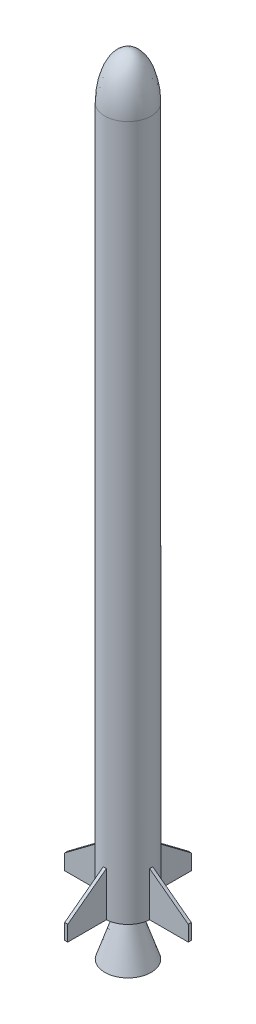
ISO-10303-21;
HEADER;
FILE_DESCRIPTION(('STEP AP214'),'2;1');
FILE_NAME('part.step','',(''),(''),'','','');
FILE_SCHEMA(('AUTOMOTIVE_DESIGN { 1 0 10303 214 1 1 1 1 }'));
ENDSEC;
DATA;
#1=APPLICATION_CONTEXT('core data for automotive mechanical design processes');
#2=APPLICATION_PROTOCOL_DEFINITION('international standard','automotive_design',2000,#1);
#3=PRODUCT_CONTEXT('',#1,'mechanical');
#4=PRODUCT('Part','Part','',(#3));
#5=PRODUCT_RELATED_PRODUCT_CATEGORY('part','',(#4));
#6=PRODUCT_DEFINITION_FORMATION('','',#4);
#7=PRODUCT_DEFINITION_CONTEXT('part definition',#1,'design');
#8=PRODUCT_DEFINITION('design','',#6,#7);
#9=PRODUCT_DEFINITION_SHAPE('','',#8);
#10=(LENGTH_UNIT() NAMED_UNIT(*) SI_UNIT(.MILLI.,.METRE.));
#11=(NAMED_UNIT(*) PLANE_ANGLE_UNIT() SI_UNIT($,.RADIAN.));
#12=(NAMED_UNIT(*) SI_UNIT($,.STERADIAN.) SOLID_ANGLE_UNIT());
#13=UNCERTAINTY_MEASURE_WITH_UNIT(LENGTH_MEASURE(1.E-05),#10,'distance_accuracy_value','');
#14=(GEOMETRIC_REPRESENTATION_CONTEXT(3) GLOBAL_UNCERTAINTY_ASSIGNED_CONTEXT((#13)) GLOBAL_UNIT_ASSIGNED_CONTEXT((#10,
#11,#12)) REPRESENTATION_CONTEXT('',''));
#15=CARTESIAN_POINT('',(0.,0.,0.));
#16=DIRECTION('',(0.,0.,1.));
#17=DIRECTION('',(1.,0.,0.));
#18=AXIS2_PLACEMENT_3D('',#15,#16,#17);
#19=CARTESIAN_POINT('',(0.,0.,0.));
#20=DIRECTION('',(0.,-1.,0.));
#21=DIRECTION('',(0.,0.,-1.));
#22=AXIS2_PLACEMENT_3D('',#19,#20,#21);
#23=CYLINDRICAL_SURFACE('',#22,38.1);
#24=CARTESIAN_POINT('',(0.,1143.,0.));
#25=DIRECTION('',(0.,-1.,0.));
#26=DIRECTION('',(0.,0.,-1.));
#27=AXIS2_PLACEMENT_3D('',#24,#25,#26);
#28=CIRCLE('',#27,38.1);
#29=CARTESIAN_POINT('',(0.,1143.,-38.1));
#30=VERTEX_POINT('',#29);
#31=EDGE_CURVE('E449',#30,#30,#28,.T.);
#32=ORIENTED_EDGE('',*,*,#31,.T.);
#33=EDGE_LOOP('',(#32));
#34=FACE_BOUND('',#33,.T.);
#35=CARTESIAN_POINT('',(0.,101.6,0.));
#36=DIRECTION('',(0.,0.8,-0.6));
#37=DIRECTION('',(0.,-0.6,-0.8));
#38=AXIS2_PLACEMENT_3D('',#35,#36,#37);
#39=ELLIPSE('',#38,47.625,38.1);
#40=CARTESIAN_POINT('',(-2.54000000000013,73.0885707127825,-38.0152390496233));
#41=VERTEX_POINT('',#40);
#42=CARTESIAN_POINT('',(2.53999999999987,73.0885707127826,-38.0152390496232));
#43=VERTEX_POINT('',#42);
#44=EDGE_CURVE('E81',#41,#43,#39,.F.);
#45=ORIENTED_EDGE('',*,*,#44,.F.);
#46=DIRECTION('',(0.,-1.,0.));
#47=VECTOR('',#46,1.);
#48=CARTESIAN_POINT('',(-2.54000000000013,0.,-38.0152390496232));
#49=LINE('',#48,#47);
#50=CARTESIAN_POINT('',(-2.54000000000013,0.,-38.0152390496232));
#51=VERTEX_POINT('',#50);
#52=EDGE_CURVE('E394',#41,#51,#49,.T.);
#53=ORIENTED_EDGE('',*,*,#52,.T.);
#54=CARTESIAN_POINT('',(0.,0.,0.));
#55=DIRECTION('',(0.,-1.,0.));
#56=DIRECTION('',(0.,0.,-1.));
#57=AXIS2_PLACEMENT_3D('',#54,#55,#56);
#58=CIRCLE('',#57,38.1);
#59=CARTESIAN_POINT('',(-38.0152390496232,0.,-2.54));
#60=VERTEX_POINT('',#59);
#61=EDGE_CURVE('E608',#60,#51,#58,.T.);
#62=ORIENTED_EDGE('',*,*,#61,.F.);
#63=DIRECTION('',(0.,-1.,0.));
#64=VECTOR('',#63,1.);
#65=CARTESIAN_POINT('',(-38.0152390496232,0.,-2.54));
#66=LINE('',#65,#64);
#67=CARTESIAN_POINT('',(-38.0152390496233,73.0885707127825,-2.54));
#68=VERTEX_POINT('',#67);
#69=EDGE_CURVE('E363',#68,#60,#66,.T.);
#70=ORIENTED_EDGE('',*,*,#69,.F.);
#71=CARTESIAN_POINT('',(0.,101.6,0.));
#72=DIRECTION('',(-0.6,0.8,0.));
#73=DIRECTION('',(-0.8,-0.6,0.));
#74=AXIS2_PLACEMENT_3D('',#71,#72,#73);
#75=ELLIPSE('',#74,47.625,38.1);
#76=CARTESIAN_POINT('',(-38.0152390496233,73.0885707127825,2.54));
#77=VERTEX_POINT('',#76);
#78=EDGE_CURVE('E505',#77,#68,#75,.F.);
#79=ORIENTED_EDGE('',*,*,#78,.F.);
#80=DIRECTION('',(0.,-1.,0.));
#81=VECTOR('',#80,1.);
#82=CARTESIAN_POINT('',(-38.0152390496232,0.,2.54));
#83=LINE('',#82,#81);
#84=CARTESIAN_POINT('',(-38.0152390496232,0.,2.54));
#85=VERTEX_POINT('',#84);
#86=EDGE_CURVE('E359',#77,#85,#83,.T.);
#87=ORIENTED_EDGE('',*,*,#86,.T.);
#88=CARTESIAN_POINT('',(-2.5399999999996,0.,38.0152390496233));
#89=VERTEX_POINT('',#88);
#90=EDGE_CURVE('E614',#89,#85,#58,.T.);
#91=ORIENTED_EDGE('',*,*,#90,.F.);
#92=DIRECTION('',(0.,-1.,0.));
#93=VECTOR('',#92,1.);
#94=CARTESIAN_POINT('',(-2.5399999999996,0.,38.0152390496233));
#95=LINE('',#94,#93);
#96=CARTESIAN_POINT('',(-2.5399999999996,73.0885707127825,38.0152390496233));
#97=VERTEX_POINT('',#96);
#98=EDGE_CURVE('E187',#97,#89,#95,.T.);
#99=ORIENTED_EDGE('',*,*,#98,.F.);
#100=CARTESIAN_POINT('',(0.,101.6,0.));
#101=DIRECTION('',(0.,0.8,0.6));
#102=DIRECTION('',(0.,-0.6,0.8));
#103=AXIS2_PLACEMENT_3D('',#100,#101,#102);
#104=ELLIPSE('',#103,47.625,38.1);
#105=CARTESIAN_POINT('',(2.5400000000004,73.0885707127825,38.0152390496232));
#106=VERTEX_POINT('',#105);
#107=EDGE_CURVE('E592',#106,#97,#104,.F.);
#108=ORIENTED_EDGE('',*,*,#107,.F.);
#109=DIRECTION('',(0.,-1.,0.));
#110=VECTOR('',#109,1.);
#111=CARTESIAN_POINT('',(2.54000000000013,0.,38.0152390496232));
#112=LINE('',#111,#110);
#113=CARTESIAN_POINT('',(2.54000000000013,0.,38.0152390496232));
#114=VERTEX_POINT('',#113);
#115=EDGE_CURVE('E379',#114,#106,#112,.F.);
#116=ORIENTED_EDGE('',*,*,#115,.F.);
#117=CARTESIAN_POINT('',(38.0152390496232,0.,2.54));
#118=VERTEX_POINT('',#117);
#119=EDGE_CURVE('E454',#118,#114,#58,.T.);
#120=ORIENTED_EDGE('',*,*,#119,.F.);
#121=DIRECTION('',(0.,-1.,0.));
#122=VECTOR('',#121,1.);
#123=CARTESIAN_POINT('',(38.0152390496232,0.,2.54));
#124=LINE('',#123,#122);
#125=CARTESIAN_POINT('',(38.0152390496232,73.0885707127825,2.54));
#126=VERTEX_POINT('',#125);
#127=EDGE_CURVE('E486',#126,#118,#124,.T.);
#128=ORIENTED_EDGE('',*,*,#127,.F.);
#129=CARTESIAN_POINT('',(0.,101.6,0.));
#130=DIRECTION('',(0.6,0.8,0.));
#131=DIRECTION('',(0.8,-0.6,0.));
#132=AXIS2_PLACEMENT_3D('',#129,#130,#131);
#133=ELLIPSE('',#132,47.625,38.1);
#134=CARTESIAN_POINT('',(38.0152390496233,73.0885707127825,-2.54));
#135=VERTEX_POINT('',#134);
#136=EDGE_CURVE('E491',#135,#126,#133,.F.);
#137=ORIENTED_EDGE('',*,*,#136,.F.);
#138=DIRECTION('',(0.,-1.,0.));
#139=VECTOR('',#138,1.);
#140=CARTESIAN_POINT('',(38.0152390496232,0.,-2.54));
#141=LINE('',#140,#139);
#142=CARTESIAN_POINT('',(38.0152390496232,0.,-2.54));
#143=VERTEX_POINT('',#142);
#144=EDGE_CURVE('E500',#135,#143,#141,.T.);
#145=ORIENTED_EDGE('',*,*,#144,.T.);
#146=CARTESIAN_POINT('',(2.53999999999987,0.,-38.0152390496232));
#147=VERTEX_POINT('',#146);
#148=EDGE_CURVE('E453',#147,#143,#58,.T.);
#149=ORIENTED_EDGE('',*,*,#148,.F.);
#150=DIRECTION('',(0.,-1.,0.));
#151=VECTOR('',#150,1.);
#152=CARTESIAN_POINT('',(2.53999999999987,0.,-38.0152390496232));
#153=LINE('',#152,#151);
#154=EDGE_CURVE('E374',#43,#147,#153,.T.);
#155=ORIENTED_EDGE('',*,*,#154,.F.);
#156=EDGE_LOOP('',(#45,#53,#62,#70,#79,#87,#91,#99,#108,#116,#120,#128,#137,#145,#149,#155));
#157=FACE_BOUND('',#156,.T.);
#158=ADVANCED_FACE('F57',(#34,#157),#23,.T.);
#159=CARTESIAN_POINT('',(0.,-76.2,0.));
#160=DIRECTION('',(0.,-1.,0.));
#161=DIRECTION('',(0.,0.,-1.));
#162=AXIS2_PLACEMENT_3D('',#159,#160,#161);
#163=PLANE('',#162);
#164=CARTESIAN_POINT('',(0.,-76.2,0.));
#165=DIRECTION('',(0.,-1.,0.));
#166=DIRECTION('',(0.,0.,-1.));
#167=AXIS2_PLACEMENT_3D('',#164,#165,#166);
#168=CIRCLE('',#167,31.75);
#169=CARTESIAN_POINT('',(0.,-76.2,-31.75));
#170=VERTEX_POINT('',#169);
#171=EDGE_CURVE('E12',#170,#170,#168,.T.);
#172=ORIENTED_EDGE('',*,*,#171,.F.);
#173=EDGE_LOOP('',(#172));
#174=FACE_BOUND('',#173,.T.);
#175=CARTESIAN_POINT('',(0.,-76.2,0.));
#176=DIRECTION('',(0.,-1.,0.));
#177=DIRECTION('',(0.,0.,-1.));
#178=AXIS2_PLACEMENT_3D('',#175,#176,#177);
#179=CIRCLE('',#178,38.1);
#180=CARTESIAN_POINT('',(0.,-76.2,-38.1));
#181=VERTEX_POINT('',#180);
#182=EDGE_CURVE('E472',#181,#181,#179,.T.);
#183=ORIENTED_EDGE('',*,*,#182,.T.);
#184=EDGE_LOOP('',(#183));
#185=FACE_BOUND('',#184,.T.);
#186=ADVANCED_FACE('F562',(#174,#185),#163,.T.);
#187=CARTESIAN_POINT('',(0.,-76.2,0.));
#188=DIRECTION('',(0.,-1.,0.));
#189=DIRECTION('',(0.,0.,-1.));
#190=AXIS2_PLACEMENT_3D('',#187,#188,#189);
#191=CONICAL_SURFACE('',#190,38.1,0.321750554396642);
#192=CARTESIAN_POINT('',(0.,0.,0.));
#193=DIRECTION('',(0.,-1.,0.));
#194=DIRECTION('',(0.,0.,-1.));
#195=AXIS2_PLACEMENT_3D('',#192,#193,#194);
#196=CIRCLE('',#195,12.7);
#197=CARTESIAN_POINT('',(0.,0.,-12.7));
#198=VERTEX_POINT('',#197);
#199=EDGE_CURVE('E468',#198,#198,#196,.T.);
#200=CARTESIAN_POINT('',(0.,0.,-12.7));
#201=CARTESIAN_POINT('',(0.,-0.793749999999986,-12.9645833333333));
#202=CARTESIAN_POINT('',(0.,-1.58749999999999,-13.2291666666667));
#203=CARTESIAN_POINT('',(0.,-3.17499999999999,-13.7583333333333));
#204=CARTESIAN_POINT('',(0.,-3.96874999999999,-14.0229166666667));
#205=CARTESIAN_POINT('',(0.,-5.55624999999999,-14.5520833333333));
#206=CARTESIAN_POINT('',(0.,-6.34999999999999,-14.8166666666667));
#207=CARTESIAN_POINT('',(0.,-7.93749999999999,-15.3458333333333));
#208=CARTESIAN_POINT('',(0.,-8.73124999999999,-15.6104166666667));
#209=CARTESIAN_POINT('',(0.,-10.31875,-16.1395833333333));
#210=CARTESIAN_POINT('',(0.,-11.1125,-16.4041666666667));
#211=CARTESIAN_POINT('',(0.,-12.7,-16.9333333333333));
#212=CARTESIAN_POINT('',(0.,-13.49375,-17.1979166666667));
#213=CARTESIAN_POINT('',(0.,-15.08125,-17.7270833333333));
#214=CARTESIAN_POINT('',(0.,-15.875,-17.9916666666667));
#215=CARTESIAN_POINT('',(0.,-17.4625,-18.5208333333333));
#216=CARTESIAN_POINT('',(0.,-18.25625,-18.7854166666667));
#217=CARTESIAN_POINT('',(0.,-19.84375,-19.3145833333333));
#218=CARTESIAN_POINT('',(0.,-20.6375,-19.5791666666667));
#219=CARTESIAN_POINT('',(0.,-22.225,-20.1083333333333));
#220=CARTESIAN_POINT('',(0.,-23.01875,-20.3729166666667));
#221=CARTESIAN_POINT('',(0.,-24.60625,-20.9020833333333));
#222=CARTESIAN_POINT('',(0.,-25.4,-21.1666666666667));
#223=CARTESIAN_POINT('',(0.,-26.9875,-21.6958333333333));
#224=CARTESIAN_POINT('',(0.,-27.78125,-21.9604166666667));
#225=CARTESIAN_POINT('',(0.,-29.36875,-22.4895833333333));
#226=CARTESIAN_POINT('',(0.,-30.1625,-22.7541666666667));
#227=CARTESIAN_POINT('',(0.,-31.75,-23.2833333333333));
#228=CARTESIAN_POINT('',(0.,-32.54375,-23.5479166666667));
#229=CARTESIAN_POINT('',(0.,-34.13125,-24.0770833333333));
#230=CARTESIAN_POINT('',(0.,-34.925,-24.3416666666667));
#231=CARTESIAN_POINT('',(0.,-36.5125,-24.8708333333333));
#232=CARTESIAN_POINT('',(0.,-37.30625,-25.1354166666667));
#233=CARTESIAN_POINT('',(0.,-38.89375,-25.6645833333333));
#234=CARTESIAN_POINT('',(0.,-39.6875,-25.9291666666667));
#235=CARTESIAN_POINT('',(0.,-41.275,-26.4583333333333));
#236=CARTESIAN_POINT('',(0.,-42.06875,-26.7229166666667));
#237=CARTESIAN_POINT('',(0.,-43.65625,-27.2520833333333));
#238=CARTESIAN_POINT('',(0.,-44.45,-27.5166666666667));
#239=CARTESIAN_POINT('',(0.,-46.0375,-28.0458333333333));
#240=CARTESIAN_POINT('',(0.,-46.83125,-28.3104166666667));
#241=CARTESIAN_POINT('',(0.,-48.41875,-28.8395833333333));
#242=CARTESIAN_POINT('',(0.,-49.2125,-29.1041666666667));
#243=CARTESIAN_POINT('',(0.,-50.8,-29.6333333333333));
#244=CARTESIAN_POINT('',(0.,-51.59375,-29.8979166666667));
#245=CARTESIAN_POINT('',(0.,-53.18125,-30.4270833333333));
#246=CARTESIAN_POINT('',(0.,-53.975,-30.6916666666667));
#247=CARTESIAN_POINT('',(0.,-55.5625,-31.2208333333333));
#248=CARTESIAN_POINT('',(0.,-56.35625,-31.4854166666667));
#249=CARTESIAN_POINT('',(0.,-57.94375,-32.0145833333333));
#250=CARTESIAN_POINT('',(0.,-58.7375,-32.2791666666667));
#251=CARTESIAN_POINT('',(0.,-60.325,-32.8083333333333));
#252=CARTESIAN_POINT('',(0.,-61.11875,-33.0729166666667));
#253=CARTESIAN_POINT('',(0.,-62.70625,-33.6020833333333));
#254=CARTESIAN_POINT('',(0.,-63.5,-33.8666666666667));
#255=CARTESIAN_POINT('',(0.,-65.0875,-34.3958333333333));
#256=CARTESIAN_POINT('',(0.,-65.88125,-34.6604166666667));
#257=CARTESIAN_POINT('',(0.,-67.46875,-35.1895833333333));
#258=CARTESIAN_POINT('',(0.,-68.2625,-35.4541666666667));
#259=CARTESIAN_POINT('',(0.,-69.85,-35.9833333333333));
#260=CARTESIAN_POINT('',(0.,-70.64375,-36.2479166666667));
#261=CARTESIAN_POINT('',(0.,-72.23125,-36.7770833333333));
#262=CARTESIAN_POINT('',(0.,-73.025,-37.0416666666667));
#263=CARTESIAN_POINT('',(0.,-74.6125,-37.5708333333333));
#264=CARTESIAN_POINT('',(0.,-75.40625,-37.8354166666667));
#265=CARTESIAN_POINT('',(0.,-76.2,-38.1));
#266=B_SPLINE_CURVE_WITH_KNOTS('',3,(#200,#201,#202,#203,#204,#205,#206,#207,#208,#209,#210,
#211,#212,#213,#214,#215,#216,#217,#218,#219,#220,#221,#222,#223,#224,#225,#226,#227,#228,#229,
#230,#231,#232,#233,#234,#235,#236,#237,#238,#239,#240,#241,#242,#243,#244,#245,#246,#247,#248,
#249,#250,#251,#252,#253,#254,#255,#256,#257,#258,#259,#260,#261,#262,#263,#264,#265),
.UNSPECIFIED.,.F.,.F.,(4,2,2,2,2,2,2,2,2,2,2,2,2,2,2,2,2,2,2,2,2,2,2,2,2,2,2,2,2,2,2,2,4),(0.,
2.51005789275865,5.02011578551731,7.53017367827596,10.0402315710346,12.5502894637933,
15.0603473565519,17.5704052493106,20.0804631420692,22.5905210348279,25.1005789275865,
27.6106368203452,30.1206947131038,32.6307526058625,35.1408104986211,37.6508683913798,
40.1609262841384,42.6709841768971,45.1810420696557,47.6910999624144,50.2011578551731,
52.7112157479317,55.2212736406904,57.731331533449,60.2413894262077,62.7514473189663,
65.261505211725,67.7715631044836,70.2816209972423,72.7916788900009,75.3017367827596,
77.8117946755182,80.3218525682769),.UNSPECIFIED.);
#267=EDGE_CURVE('BSEAM565',#198,#181,#266,.T.);
#268=ORIENTED_EDGE('',*,*,#199,.T.);
#269=ORIENTED_EDGE('',*,*,#182,.F.);
#270=ORIENTED_EDGE('',*,*,#267,.T.);
#271=ORIENTED_EDGE('',*,*,#267,.F.);
#272=EDGE_LOOP('',(#268,#270,#269,#271));
#273=FACE_BOUND('',#272,.T.);
#274=ADVANCED_FACE('F565',(#273),#191,.T.);
#275=CARTESIAN_POINT('',(12.7,0.,0.));
#276=DIRECTION('',(0.,-1.,0.));
#277=DIRECTION('',(0.,0.,-1.));
#278=AXIS2_PLACEMENT_3D('',#275,#276,#277);
#279=PLANE('',#278);
#280=ORIENTED_EDGE('',*,*,#199,.F.);
#281=EDGE_LOOP('',(#280));
#282=FACE_BOUND('',#281,.T.);
#283=ORIENTED_EDGE('',*,*,#61,.T.);
#284=DIRECTION('',(0.,0.,-1.));
#285=VECTOR('',#284,1.);
#286=CARTESIAN_POINT('',(-2.54,0.,0.));
#287=LINE('',#286,#285);
#288=CARTESIAN_POINT('',(-2.54000000000035,0.,-101.6));
#289=VERTEX_POINT('',#288);
#290=EDGE_CURVE('E331',#51,#289,#287,.T.);
#291=ORIENTED_EDGE('',*,*,#290,.T.);
#292=DIRECTION('',(1.,0.,0.));
#293=VECTOR('',#292,1.);
#294=CARTESIAN_POINT('',(-2.54000000000035,0.,-101.6));
#295=LINE('',#294,#293);
#296=CARTESIAN_POINT('',(2.53999999999964,0.,-101.6));
#297=VERTEX_POINT('',#296);
#298=EDGE_CURVE('E346',#289,#297,#295,.T.);
#299=ORIENTED_EDGE('',*,*,#298,.T.);
#300=DIRECTION('',(0.,0.,-1.));
#301=VECTOR('',#300,1.);
#302=CARTESIAN_POINT('',(2.54,0.,0.));
#303=LINE('',#302,#301);
#304=EDGE_CURVE('E299',#147,#297,#303,.T.);
#305=ORIENTED_EDGE('',*,*,#304,.F.);
#306=ORIENTED_EDGE('',*,*,#148,.T.);
#307=DIRECTION('',(1.,0.,0.));
#308=VECTOR('',#307,1.);
#309=CARTESIAN_POINT('',(0.,0.,-2.54));
#310=LINE('',#309,#308);
#311=CARTESIAN_POINT('',(101.6,0.,-2.54));
#312=VERTEX_POINT('',#311);
#313=EDGE_CURVE('E409',#143,#312,#310,.T.);
#314=ORIENTED_EDGE('',*,*,#313,.T.);
#315=DIRECTION('',(0.,0.,1.));
#316=VECTOR('',#315,1.);
#317=CARTESIAN_POINT('',(101.6,0.,-2.54));
#318=LINE('',#317,#316);
#319=CARTESIAN_POINT('',(101.6,0.,2.54));
#320=VERTEX_POINT('',#319);
#321=EDGE_CURVE('E432',#312,#320,#318,.T.);
#322=ORIENTED_EDGE('',*,*,#321,.T.);
#323=DIRECTION('',(1.,0.,0.));
#324=VECTOR('',#323,1.);
#325=CARTESIAN_POINT('',(0.,0.,2.54));
#326=LINE('',#325,#324);
#327=EDGE_CURVE('E390',#118,#320,#326,.T.);
#328=ORIENTED_EDGE('',*,*,#327,.F.);
#329=ORIENTED_EDGE('',*,*,#119,.T.);
#330=CARTESIAN_POINT('',(2.54000000000106,0.,101.6));
#331=VERTEX_POINT('',#330);
#332=EDGE_CURVE('E199',#331,#114,#303,.T.);
#333=ORIENTED_EDGE('',*,*,#332,.F.);
#334=DIRECTION('',(-1.,0.,0.));
#335=VECTOR('',#334,1.);
#336=CARTESIAN_POINT('',(2.54000000000106,0.,101.6));
#337=LINE('',#336,#335);
#338=CARTESIAN_POINT('',(-2.53999999999894,0.,101.6));
#339=VERTEX_POINT('',#338);
#340=EDGE_CURVE('E194',#331,#339,#337,.T.);
#341=ORIENTED_EDGE('',*,*,#340,.T.);
#342=DIRECTION('',(0.,0.,1.));
#343=VECTOR('',#342,1.);
#344=CARTESIAN_POINT('',(-2.54,0.,0.));
#345=LINE('',#344,#343);
#346=EDGE_CURVE('E180',#89,#339,#345,.T.);
#347=ORIENTED_EDGE('',*,*,#346,.F.);
#348=ORIENTED_EDGE('',*,*,#90,.T.);
#349=DIRECTION('',(-1.,0.,0.));
#350=VECTOR('',#349,1.);
#351=CARTESIAN_POINT('',(0.,0.,2.54));
#352=LINE('',#351,#350);
#353=CARTESIAN_POINT('',(-101.6,0.,2.54));
#354=VERTEX_POINT('',#353);
#355=EDGE_CURVE('E266',#85,#354,#352,.T.);
#356=ORIENTED_EDGE('',*,*,#355,.T.);
#357=DIRECTION('',(0.,0.,-1.));
#358=VECTOR('',#357,1.);
#359=CARTESIAN_POINT('',(-101.6,0.,2.54));
#360=LINE('',#359,#358);
#361=CARTESIAN_POINT('',(-101.6,0.,-2.54));
#362=VERTEX_POINT('',#361);
#363=EDGE_CURVE('E300',#354,#362,#360,.T.);
#364=ORIENTED_EDGE('',*,*,#363,.T.);
#365=DIRECTION('',(-1.,0.,0.));
#366=VECTOR('',#365,1.);
#367=CARTESIAN_POINT('',(0.,0.,-2.54));
#368=LINE('',#367,#366);
#369=EDGE_CURVE('E250',#60,#362,#368,.T.);
#370=ORIENTED_EDGE('',*,*,#369,.F.);
#371=EDGE_LOOP('',(#283,#291,#299,#305,#306,#314,#322,#328,#329,#333,#341,#347,#348,#356,#364,#370));
#372=FACE_BOUND('',#371,.T.);
#373=ADVANCED_FACE('F196',(#282,#372),#279,.T.);
#374=CARTESIAN_POINT('',(0.,1143.,0.));
#375=DIRECTION('',(0.,0.,1.));
#376=DIRECTION('',(0.,1.,0.));
#377=AXIS2_PLACEMENT_3D('',#374,#375,#376);
#378=ELLIPSE('',#377,76.2000000000003,38.1);
#379=TRIMMED_CURVE('',#378,(PARAMETER_VALUE(3.14159265358978)),
(PARAMETER_VALUE(6.28318530717957)),.T.,.PARAMETER.);
#380=CARTESIAN_POINT('',(0.,0.,0.));
#381=DIRECTION('',(0.,-1.,0.));
#382=AXIS1_PLACEMENT('',#380,#381);
#383=SURFACE_OF_REVOLUTION('',#379,#382);
#384=CARTESIAN_POINT('',(0.,1219.2,0.));
#385=VERTEX_POINT('',#384);
#386=VERTEX_LOOP('',#385);
#387=FACE_BOUND('',#386,.T.);
#388=ORIENTED_EDGE('',*,*,#31,.F.);
#389=EDGE_LOOP('',(#388));
#390=FACE_BOUND('',#389,.T.);
#391=ADVANCED_FACE('F672',(#387,#390),#383,.F.);
#392=CARTESIAN_POINT('',(101.6,25.4,-2.54));
#393=DIRECTION('',(0.6,0.8,0.));
#394=DIRECTION('',(-0.8,0.6,0.));
#395=AXIS2_PLACEMENT_3D('',#392,#393,#394);
#396=PLANE('',#395);
#397=DIRECTION('',(-0.8,0.6,0.));
#398=VECTOR('',#397,1.);
#399=CARTESIAN_POINT('',(101.6,25.4,-2.54));
#400=LINE('',#399,#398);
#401=CARTESIAN_POINT('',(101.6,25.4,-2.54));
#402=VERTEX_POINT('',#401);
#403=EDGE_CURVE('E421',#402,#135,#400,.T.);
#404=ORIENTED_EDGE('',*,*,#403,.T.);
#405=ORIENTED_EDGE('',*,*,#136,.T.);
#406=DIRECTION('',(-0.8,0.6,0.));
#407=VECTOR('',#406,1.);
#408=CARTESIAN_POINT('',(101.6,25.4,2.54));
#409=LINE('',#408,#407);
#410=CARTESIAN_POINT('',(101.6,25.4,2.54));
#411=VERTEX_POINT('',#410);
#412=EDGE_CURVE('E404',#411,#126,#409,.T.);
#413=ORIENTED_EDGE('',*,*,#412,.F.);
#414=DIRECTION('',(0.,0.,1.));
#415=VECTOR('',#414,1.);
#416=CARTESIAN_POINT('',(101.6,25.4,-2.54));
#417=LINE('',#416,#415);
#418=EDGE_CURVE('E437',#402,#411,#417,.T.);
#419=ORIENTED_EDGE('',*,*,#418,.F.);
#420=EDGE_LOOP('',(#404,#405,#413,#419));
#421=FACE_BOUND('',#420,.T.);
#422=ADVANCED_FACE('F679',(#421),#396,.T.);
#423=CARTESIAN_POINT('',(101.6,0.,-2.54));
#424=DIRECTION('',(1.,0.,0.));
#425=DIRECTION('',(0.,0.,-1.));
#426=AXIS2_PLACEMENT_3D('',#423,#424,#425);
#427=PLANE('',#426);
#428=ORIENTED_EDGE('',*,*,#418,.T.);
#429=DIRECTION('',(0.,1.,0.));
#430=VECTOR('',#429,1.);
#431=CARTESIAN_POINT('',(101.6,0.,2.54));
#432=LINE('',#431,#430);
#433=EDGE_CURVE('E393',#320,#411,#432,.T.);
#434=ORIENTED_EDGE('',*,*,#433,.F.);
#435=ORIENTED_EDGE('',*,*,#321,.F.);
#436=DIRECTION('',(0.,1.,0.));
#437=VECTOR('',#436,1.);
#438=CARTESIAN_POINT('',(101.6,0.,-2.54));
#439=LINE('',#438,#437);
#440=EDGE_CURVE('E417',#312,#402,#439,.T.);
#441=ORIENTED_EDGE('',*,*,#440,.T.);
#442=EDGE_LOOP('',(#428,#434,#435,#441));
#443=FACE_BOUND('',#442,.T.);
#444=ADVANCED_FACE('F681',(#443),#427,.T.);
#445=CARTESIAN_POINT('',(0.,0.,-2.54));
#446=DIRECTION('',(0.,0.,1.));
#447=DIRECTION('',(1.,0.,0.));
#448=AXIS2_PLACEMENT_3D('',#445,#446,#447);
#449=PLANE('',#448);
#450=ORIENTED_EDGE('',*,*,#144,.F.);
#451=ORIENTED_EDGE('',*,*,#403,.F.);
#452=ORIENTED_EDGE('',*,*,#440,.F.);
#453=ORIENTED_EDGE('',*,*,#313,.F.);
#454=EDGE_LOOP('',(#450,#451,#452,#453));
#455=FACE_BOUND('',#454,.T.);
#456=ADVANCED_FACE('F684',(#455),#449,.F.);
#457=CARTESIAN_POINT('',(0.,0.,2.54));
#458=DIRECTION('',(0.,0.,1.));
#459=DIRECTION('',(1.,0.,0.));
#460=AXIS2_PLACEMENT_3D('',#457,#458,#459);
#461=PLANE('',#460);
#462=ORIENTED_EDGE('',*,*,#412,.T.);
#463=ORIENTED_EDGE('',*,*,#127,.T.);
#464=ORIENTED_EDGE('',*,*,#327,.T.);
#465=ORIENTED_EDGE('',*,*,#433,.T.);
#466=EDGE_LOOP('',(#462,#463,#464,#465));
#467=FACE_BOUND('',#466,.T.);
#468=ADVANCED_FACE('F691',(#467),#461,.T.);
#469=CARTESIAN_POINT('',(-101.6,0.,2.54));
#470=DIRECTION('',(-1.,0.,0.));
#471=DIRECTION('',(0.,0.,1.));
#472=AXIS2_PLACEMENT_3D('',#469,#470,#471);
#473=PLANE('',#472);
#474=DIRECTION('',(0.,0.,-1.));
#475=VECTOR('',#474,1.);
#476=CARTESIAN_POINT('',(-101.6,25.4,2.54));
#477=LINE('',#476,#475);
#478=CARTESIAN_POINT('',(-101.6,25.4,2.54));
#479=VERTEX_POINT('',#478);
#480=CARTESIAN_POINT('',(-101.6,25.4,-2.54));
#481=VERTEX_POINT('',#480);
#482=EDGE_CURVE('E295',#479,#481,#477,.T.);
#483=ORIENTED_EDGE('',*,*,#482,.T.);
#484=DIRECTION('',(0.,1.,0.));
#485=VECTOR('',#484,1.);
#486=CARTESIAN_POINT('',(-101.6,0.,-2.54));
#487=LINE('',#486,#485);
#488=EDGE_CURVE('E267',#362,#481,#487,.T.);
#489=ORIENTED_EDGE('',*,*,#488,.F.);
#490=ORIENTED_EDGE('',*,*,#363,.F.);
#491=DIRECTION('',(0.,1.,0.));
#492=VECTOR('',#491,1.);
#493=CARTESIAN_POINT('',(-101.6,0.,2.54));
#494=LINE('',#493,#492);
#495=EDGE_CURVE('E279',#354,#479,#494,.T.);
#496=ORIENTED_EDGE('',*,*,#495,.T.);
#497=EDGE_LOOP('',(#483,#489,#490,#496));
#498=FACE_BOUND('',#497,.T.);
#499=ADVANCED_FACE('F695',(#498),#473,.T.);
#500=CARTESIAN_POINT('',(-101.6,25.4,2.54));
#501=DIRECTION('',(-0.6,0.8,0.));
#502=DIRECTION('',(-0.8,-0.6,0.));
#503=AXIS2_PLACEMENT_3D('',#500,#501,#502);
#504=PLANE('',#503);
#505=DIRECTION('',(0.8,0.6,0.));
#506=VECTOR('',#505,1.);
#507=CARTESIAN_POINT('',(-101.6,25.4,2.54));
#508=LINE('',#507,#506);
#509=EDGE_CURVE('E283',#479,#77,#508,.T.);
#510=ORIENTED_EDGE('',*,*,#509,.T.);
#511=ORIENTED_EDGE('',*,*,#78,.T.);
#512=DIRECTION('',(0.8,0.6,0.));
#513=VECTOR('',#512,1.);
#514=CARTESIAN_POINT('',(-101.6,25.4,-2.54));
#515=LINE('',#514,#513);
#516=EDGE_CURVE('E262',#481,#68,#515,.T.);
#517=ORIENTED_EDGE('',*,*,#516,.F.);
#518=ORIENTED_EDGE('',*,*,#482,.F.);
#519=EDGE_LOOP('',(#510,#511,#517,#518));
#520=FACE_BOUND('',#519,.T.);
#521=ADVANCED_FACE('F715',(#520),#504,.T.);
#522=CARTESIAN_POINT('',(0.,0.,-2.54));
#523=DIRECTION('',(0.,0.,-1.));
#524=DIRECTION('',(-1.,0.,0.));
#525=AXIS2_PLACEMENT_3D('',#522,#523,#524);
#526=PLANE('',#525);
#527=ORIENTED_EDGE('',*,*,#516,.T.);
#528=ORIENTED_EDGE('',*,*,#69,.T.);
#529=ORIENTED_EDGE('',*,*,#369,.T.);
#530=ORIENTED_EDGE('',*,*,#488,.T.);
#531=EDGE_LOOP('',(#527,#528,#529,#530));
#532=FACE_BOUND('',#531,.T.);
#533=ADVANCED_FACE('F719',(#532),#526,.T.);
#534=CARTESIAN_POINT('',(0.,0.,2.54));
#535=DIRECTION('',(0.,0.,-1.));
#536=DIRECTION('',(-1.,0.,0.));
#537=AXIS2_PLACEMENT_3D('',#534,#535,#536);
#538=PLANE('',#537);
#539=ORIENTED_EDGE('',*,*,#86,.F.);
#540=ORIENTED_EDGE('',*,*,#509,.F.);
#541=ORIENTED_EDGE('',*,*,#495,.F.);
#542=ORIENTED_EDGE('',*,*,#355,.F.);
#543=EDGE_LOOP('',(#539,#540,#541,#542));
#544=FACE_BOUND('',#543,.T.);
#545=ADVANCED_FACE('F721',(#544),#538,.F.);
#546=CARTESIAN_POINT('',(2.54000000000106,0.,101.6));
#547=DIRECTION('',(0.,0.,1.));
#548=DIRECTION('',(1.,0.,0.));
#549=AXIS2_PLACEMENT_3D('',#546,#547,#548);
#550=PLANE('',#549);
#551=DIRECTION('',(-1.,0.,0.));
#552=VECTOR('',#551,1.);
#553=CARTESIAN_POINT('',(2.54000000000106,25.4,101.6));
#554=LINE('',#553,#552);
#555=CARTESIAN_POINT('',(2.54000000000106,25.4,101.6));
#556=VERTEX_POINT('',#555);
#557=CARTESIAN_POINT('',(-2.53999999999894,25.4,101.6));
#558=VERTEX_POINT('',#557);
#559=EDGE_CURVE('E204',#556,#558,#554,.T.);
#560=ORIENTED_EDGE('',*,*,#559,.T.);
#561=DIRECTION('',(0.,1.,0.));
#562=VECTOR('',#561,1.);
#563=CARTESIAN_POINT('',(-2.53999999999894,0.,101.6));
#564=LINE('',#563,#562);
#565=EDGE_CURVE('E185',#339,#558,#564,.T.);
#566=ORIENTED_EDGE('',*,*,#565,.F.);
#567=ORIENTED_EDGE('',*,*,#340,.F.);
#568=DIRECTION('',(0.,1.,0.));
#569=VECTOR('',#568,1.);
#570=CARTESIAN_POINT('',(2.54000000000106,0.,101.6));
#571=LINE('',#570,#569);
#572=EDGE_CURVE('E213',#331,#556,#571,.T.);
#573=ORIENTED_EDGE('',*,*,#572,.T.);
#574=EDGE_LOOP('',(#560,#566,#567,#573));
#575=FACE_BOUND('',#574,.T.);
#576=ADVANCED_FACE('F207',(#575),#550,.T.);
#577=CARTESIAN_POINT('',(-2.54,0.,0.));
#578=DIRECTION('',(-1.,0.,0.));
#579=DIRECTION('',(0.,0.,1.));
#580=AXIS2_PLACEMENT_3D('',#577,#578,#579);
#581=PLANE('',#580);
#582=DIRECTION('',(0.,0.6,-0.8));
#583=VECTOR('',#582,1.);
#584=CARTESIAN_POINT('',(-2.53999999999894,25.4,101.6));
#585=LINE('',#584,#583);
#586=EDGE_CURVE('E209',#558,#97,#585,.T.);
#587=ORIENTED_EDGE('',*,*,#586,.T.);
#588=ORIENTED_EDGE('',*,*,#98,.T.);
#589=ORIENTED_EDGE('',*,*,#346,.T.);
#590=ORIENTED_EDGE('',*,*,#565,.T.);
#591=EDGE_LOOP('',(#587,#588,#589,#590));
#592=FACE_BOUND('',#591,.T.);
#593=ADVANCED_FACE('F183',(#592),#581,.T.);
#594=CARTESIAN_POINT('',(2.54000000000106,25.4,101.6));
#595=DIRECTION('',(0.,0.8,0.6));
#596=DIRECTION('',(0.,-0.6,0.8));
#597=AXIS2_PLACEMENT_3D('',#594,#595,#596);
#598=PLANE('',#597);
#599=DIRECTION('',(0.,0.6,-0.8));
#600=VECTOR('',#599,1.);
#601=CARTESIAN_POINT('',(2.54000000000106,25.4,101.6));
#602=LINE('',#601,#600);
#603=EDGE_CURVE('E205',#556,#106,#602,.T.);
#604=ORIENTED_EDGE('',*,*,#603,.T.);
#605=ORIENTED_EDGE('',*,*,#107,.T.);
#606=ORIENTED_EDGE('',*,*,#586,.F.);
#607=ORIENTED_EDGE('',*,*,#559,.F.);
#608=EDGE_LOOP('',(#604,#605,#606,#607));
#609=FACE_BOUND('',#608,.T.);
#610=ADVANCED_FACE('F730',(#609),#598,.T.);
#611=CARTESIAN_POINT('',(2.54,0.,0.));
#612=DIRECTION('',(1.,0.,0.));
#613=DIRECTION('',(0.,0.,-1.));
#614=AXIS2_PLACEMENT_3D('',#611,#612,#613);
#615=PLANE('',#614);
#616=ORIENTED_EDGE('',*,*,#332,.T.);
#617=ORIENTED_EDGE('',*,*,#115,.T.);
#618=ORIENTED_EDGE('',*,*,#603,.F.);
#619=ORIENTED_EDGE('',*,*,#572,.F.);
#620=EDGE_LOOP('',(#616,#617,#618,#619));
#621=FACE_BOUND('',#620,.T.);
#622=ADVANCED_FACE('F705',(#621),#615,.T.);
#623=CARTESIAN_POINT('',(-2.54000000000035,25.4,-101.6));
#624=DIRECTION('',(0.,0.8,-0.6));
#625=DIRECTION('',(0.,0.6,0.8));
#626=AXIS2_PLACEMENT_3D('',#623,#624,#625);
#627=PLANE('',#626);
#628=DIRECTION('',(0.,0.6,0.8));
#629=VECTOR('',#628,1.);
#630=CARTESIAN_POINT('',(-2.54000000000035,25.4,-101.6));
#631=LINE('',#630,#629);
#632=CARTESIAN_POINT('',(-2.54000000000035,25.4,-101.6));
#633=VERTEX_POINT('',#632);
#634=EDGE_CURVE('E342',#633,#41,#631,.T.);
#635=ORIENTED_EDGE('',*,*,#634,.T.);
#636=ORIENTED_EDGE('',*,*,#44,.T.);
#637=DIRECTION('',(0.,0.6,0.8));
#638=VECTOR('',#637,1.);
#639=CARTESIAN_POINT('',(2.53999999999964,25.4,-101.6));
#640=LINE('',#639,#638);
#641=CARTESIAN_POINT('',(2.53999999999964,25.4,-101.6));
#642=VERTEX_POINT('',#641);
#643=EDGE_CURVE('E326',#642,#43,#640,.T.);
#644=ORIENTED_EDGE('',*,*,#643,.F.);
#645=DIRECTION('',(1.,0.,0.));
#646=VECTOR('',#645,1.);
#647=CARTESIAN_POINT('',(-2.54000000000035,25.4,-101.6));
#648=LINE('',#647,#646);
#649=EDGE_CURVE('E348',#633,#642,#648,.T.);
#650=ORIENTED_EDGE('',*,*,#649,.F.);
#651=EDGE_LOOP('',(#635,#636,#644,#650));
#652=FACE_BOUND('',#651,.T.);
#653=ADVANCED_FACE('F701',(#652),#627,.T.);
#654=CARTESIAN_POINT('',(-2.54000000000035,0.,-101.6));
#655=DIRECTION('',(0.,0.,-1.));
#656=DIRECTION('',(-1.,0.,0.));
#657=AXIS2_PLACEMENT_3D('',#654,#655,#656);
#658=PLANE('',#657);
#659=ORIENTED_EDGE('',*,*,#649,.T.);
#660=DIRECTION('',(0.,1.,0.));
#661=VECTOR('',#660,1.);
#662=CARTESIAN_POINT('',(2.53999999999964,0.,-101.6));
#663=LINE('',#662,#661);
#664=EDGE_CURVE('E311',#297,#642,#663,.T.);
#665=ORIENTED_EDGE('',*,*,#664,.F.);
#666=ORIENTED_EDGE('',*,*,#298,.F.);
#667=DIRECTION('',(0.,1.,0.));
#668=VECTOR('',#667,1.);
#669=CARTESIAN_POINT('',(-2.54000000000035,0.,-101.6));
#670=LINE('',#669,#668);
#671=EDGE_CURVE('E347',#289,#633,#670,.T.);
#672=ORIENTED_EDGE('',*,*,#671,.T.);
#673=EDGE_LOOP('',(#659,#665,#666,#672));
#674=FACE_BOUND('',#673,.T.);
#675=ADVANCED_FACE('F697',(#674),#658,.T.);
#676=CARTESIAN_POINT('',(-2.54,0.,0.));
#677=DIRECTION('',(1.,0.,0.));
#678=DIRECTION('',(0.,0.,-1.));
#679=AXIS2_PLACEMENT_3D('',#676,#677,#678);
#680=PLANE('',#679);
#681=ORIENTED_EDGE('',*,*,#52,.F.);
#682=ORIENTED_EDGE('',*,*,#634,.F.);
#683=ORIENTED_EDGE('',*,*,#671,.F.);
#684=ORIENTED_EDGE('',*,*,#290,.F.);
#685=EDGE_LOOP('',(#681,#682,#683,#684));
#686=FACE_BOUND('',#685,.T.);
#687=ADVANCED_FACE('F700',(#686),#680,.F.);
#688=ORIENTED_EDGE('',*,*,#643,.T.);
#689=ORIENTED_EDGE('',*,*,#154,.T.);
#690=ORIENTED_EDGE('',*,*,#304,.T.);
#691=ORIENTED_EDGE('',*,*,#664,.T.);
#692=EDGE_LOOP('',(#688,#689,#690,#691));
#693=FACE_BOUND('',#692,.T.);
#694=ADVANCED_FACE('F558',(#693),#615,.T.);
#695=CARTESIAN_POINT('',(0.,-78.74,0.));
#696=DIRECTION('',(0.,1.,0.));
#697=DIRECTION('',(0.,0.,1.));
#698=AXIS2_PLACEMENT_3D('',#695,#696,#697);
#699=CYLINDRICAL_SURFACE('',#698,31.75);
#700=CARTESIAN_POINT('',(0.,-78.74,0.));
#701=DIRECTION('',(0.,-1.,0.));
#702=DIRECTION('',(0.,0.,-1.));
#703=AXIS2_PLACEMENT_3D('',#700,#701,#702);
#704=CIRCLE('',#703,31.75);
#705=CARTESIAN_POINT('',(0.,-78.74,-31.75));
#706=VERTEX_POINT('',#705);
#707=EDGE_CURVE('E191',#706,#706,#704,.T.);
#708=ORIENTED_EDGE('',*,*,#707,.F.);
#709=EDGE_LOOP('',(#708));
#710=FACE_BOUND('',#709,.T.);
#711=ORIENTED_EDGE('',*,*,#171,.T.);
#712=EDGE_LOOP('',(#711));
#713=FACE_BOUND('',#712,.T.);
#714=ADVANCED_FACE('F555',(#710,#713),#699,.T.);
#715=CARTESIAN_POINT('',(0.,-78.74,0.));
#716=DIRECTION('',(0.,-1.,0.));
#717=DIRECTION('',(0.,0.,-1.));
#718=AXIS2_PLACEMENT_3D('',#715,#716,#717);
#719=PLANE('',#718);
#720=ORIENTED_EDGE('',*,*,#707,.T.);
#721=EDGE_LOOP('',(#720));
#722=FACE_BOUND('',#721,.T.);
#723=ADVANCED_FACE('F553',(#722),#719,.T.);
#724=CLOSED_SHELL('',(#158,#186,#274,#373,#391,#422,#444,#456,#468,#499,#521,#533,#545,#576,
#593,#610,#622,#653,#675,#687,#694,#714,#723));
#725=CARTESIAN_POINT('',(0.,0.,0.));
#726=DIRECTION('',(0.,-1.,0.));
#727=DIRECTION('',(0.,0.,-1.));
#728=AXIS2_PLACEMENT_3D('',#725,#726,#727);
#729=CYLINDRICAL_SURFACE('',#728,35.56);
#730=CARTESIAN_POINT('',(0.,1143.,0.));
#731=DIRECTION('',(0.,-1.,0.));
#732=DIRECTION('',(0.,0.,-1.));
#733=AXIS2_PLACEMENT_3D('',#730,#731,#732);
#734=CIRCLE('',#733,35.56);
#735=CARTESIAN_POINT('',(0.,1143.,-35.56));
#736=VERTEX_POINT('',#735);
#737=EDGE_CURVE('E62',#736,#736,#734,.T.);
#738=ORIENTED_EDGE('',*,*,#737,.F.);
#739=EDGE_LOOP('',(#738));
#740=FACE_BOUND('',#739,.T.);
#741=CARTESIAN_POINT('',(0.,2.54,0.));
#742=DIRECTION('',(0.,-1.,0.));
#743=DIRECTION('',(0.,0.,-1.));
#744=AXIS2_PLACEMENT_3D('',#741,#742,#743);
#745=CIRCLE('',#744,35.56);
#746=CARTESIAN_POINT('',(0.,2.54,-35.56));
#747=VERTEX_POINT('',#746);
#748=EDGE_CURVE('E70',#747,#747,#745,.T.);
#749=ORIENTED_EDGE('',*,*,#748,.T.);
#750=EDGE_LOOP('',(#749));
#751=FACE_BOUND('',#750,.T.);
#752=ADVANCED_FACE('F644',(#740,#751),#729,.F.);
#753=CARTESIAN_POINT('',(0.,-73.66,0.));
#754=DIRECTION('',(0.,-1.,0.));
#755=DIRECTION('',(0.,0.,-1.));
#756=AXIS2_PLACEMENT_3D('',#753,#754,#755);
#757=PLANE('',#756);
#758=CARTESIAN_POINT('',(0.,-73.66,0.));
#759=DIRECTION('',(0.,-1.,0.));
#760=DIRECTION('',(0.,0.,-1.));
#761=AXIS2_PLACEMENT_3D('',#758,#759,#760);
#762=CIRCLE('',#761,34.5759382477241);
#763=CARTESIAN_POINT('',(0.,-73.66,-34.5759382477241));
#764=VERTEX_POINT('',#763);
#765=EDGE_CURVE('E513',#764,#764,#762,.T.);
#766=ORIENTED_EDGE('',*,*,#765,.F.);
#767=EDGE_LOOP('',(#766));
#768=FACE_BOUND('',#767,.T.);
#769=ADVANCED_FACE('F647',(#768),#757,.F.);
#770=CARTESIAN_POINT('',(0.,-77.0032185256828,0.));
#771=DIRECTION('',(0.,-1.,0.));
#772=DIRECTION('',(0.,0.,-1.));
#773=AXIS2_PLACEMENT_3D('',#770,#771,#772);
#774=CONICAL_SURFACE('',#773,35.6903444229517,0.321750554396642);
#775=CARTESIAN_POINT('',(0.,2.54,0.));
#776=DIRECTION('',(0.,-1.,0.));
#777=DIRECTION('',(0.,0.,-1.));
#778=AXIS2_PLACEMENT_3D('',#775,#776,#777);
#779=CIRCLE('',#778,9.1759382477241);
#780=CARTESIAN_POINT('',(0.,2.54,-9.1759382477241));
#781=VERTEX_POINT('',#780);
#782=EDGE_CURVE('E517',#781,#781,#779,.T.);
#783=CARTESIAN_POINT('',(0.,2.54,-9.1759382477241));
#784=CARTESIAN_POINT('',(0.,1.74625,-9.44052158105744));
#785=CARTESIAN_POINT('',(0.,0.9525,-9.70510491439077));
#786=CARTESIAN_POINT('',(0.,-0.635000000000001,-10.2342715810574));
#787=CARTESIAN_POINT('',(0.,-1.42875,-10.4988549143908));
#788=CARTESIAN_POINT('',(0.,-3.01625,-11.0280215810574));
#789=CARTESIAN_POINT('',(0.,-3.81,-11.2926049143908));
#790=CARTESIAN_POINT('',(0.,-5.3975,-11.8217715810574));
#791=CARTESIAN_POINT('',(0.,-6.19125,-12.0863549143908));
#792=CARTESIAN_POINT('',(0.,-7.77875,-12.6155215810574));
#793=CARTESIAN_POINT('',(0.,-8.5725,-12.8801049143908));
#794=CARTESIAN_POINT('',(0.,-10.16,-13.4092715810574));
#795=CARTESIAN_POINT('',(0.,-10.95375,-13.6738549143908));
#796=CARTESIAN_POINT('',(0.,-12.54125,-14.2030215810574));
#797=CARTESIAN_POINT('',(0.,-13.335,-14.4676049143908));
#798=CARTESIAN_POINT('',(0.,-14.9225,-14.9967715810574));
#799=CARTESIAN_POINT('',(0.,-15.71625,-15.2613549143908));
#800=CARTESIAN_POINT('',(0.,-17.30375,-15.7905215810574));
#801=CARTESIAN_POINT('',(0.,-18.0975,-16.0551049143908));
#802=CARTESIAN_POINT('',(0.,-19.685,-16.5842715810574));
#803=CARTESIAN_POINT('',(0.,-20.47875,-16.8488549143908));
#804=CARTESIAN_POINT('',(0.,-22.06625,-17.3780215810574));
#805=CARTESIAN_POINT('',(0.,-22.86,-17.6426049143908));
#806=CARTESIAN_POINT('',(0.,-24.4475,-18.1717715810574));
#807=CARTESIAN_POINT('',(0.,-25.24125,-18.4363549143908));
#808=CARTESIAN_POINT('',(0.,-26.82875,-18.9655215810574));
#809=CARTESIAN_POINT('',(0.,-27.6225,-19.2301049143908));
#810=CARTESIAN_POINT('',(0.,-29.21,-19.7592715810574));
#811=CARTESIAN_POINT('',(0.,-30.00375,-20.0238549143908));
#812=CARTESIAN_POINT('',(0.,-31.59125,-20.5530215810574));
#813=CARTESIAN_POINT('',(0.,-32.385,-20.8176049143908));
#814=CARTESIAN_POINT('',(0.,-33.9725,-21.3467715810574));
#815=CARTESIAN_POINT('',(0.,-34.76625,-21.6113549143908));
#816=CARTESIAN_POINT('',(0.,-36.35375,-22.1405215810574));
#817=CARTESIAN_POINT('',(0.,-37.1475,-22.4051049143908));
#818=CARTESIAN_POINT('',(0.,-38.735,-22.9342715810574));
#819=CARTESIAN_POINT('',(0.,-39.52875,-23.1988549143908));
#820=CARTESIAN_POINT('',(0.,-41.11625,-23.7280215810574));
#821=CARTESIAN_POINT('',(0.,-41.91,-23.9926049143908));
#822=CARTESIAN_POINT('',(0.,-43.4975,-24.5217715810574));
#823=CARTESIAN_POINT('',(0.,-44.29125,-24.7863549143908));
#824=CARTESIAN_POINT('',(0.,-45.87875,-25.3155215810574));
#825=CARTESIAN_POINT('',(0.,-46.6725,-25.5801049143908));
#826=CARTESIAN_POINT('',(0.,-48.26,-26.1092715810574));
#827=CARTESIAN_POINT('',(0.,-49.05375,-26.3738549143908));
#828=CARTESIAN_POINT('',(0.,-50.64125,-26.9030215810574));
#829=CARTESIAN_POINT('',(0.,-51.435,-27.1676049143908));
#830=CARTESIAN_POINT('',(0.,-53.0225,-27.6967715810574));
#831=CARTESIAN_POINT('',(0.,-53.81625,-27.9613549143908));
#832=CARTESIAN_POINT('',(0.,-55.40375,-28.4905215810574));
#833=CARTESIAN_POINT('',(0.,-56.1975,-28.7551049143908));
#834=CARTESIAN_POINT('',(0.,-57.785,-29.2842715810574));
#835=CARTESIAN_POINT('',(0.,-58.57875,-29.5488549143908));
#836=CARTESIAN_POINT('',(0.,-60.16625,-30.0780215810574));
#837=CARTESIAN_POINT('',(0.,-60.96,-30.3426049143908));
#838=CARTESIAN_POINT('',(0.,-62.5475,-30.8717715810574));
#839=CARTESIAN_POINT('',(0.,-63.34125,-31.1363549143908));
#840=CARTESIAN_POINT('',(0.,-64.92875,-31.6655215810574));
#841=CARTESIAN_POINT('',(0.,-65.7225,-31.9301049143908));
#842=CARTESIAN_POINT('',(0.,-67.31,-32.4592715810574));
#843=CARTESIAN_POINT('',(0.,-68.10375,-32.7238549143908));
#844=CARTESIAN_POINT('',(0.,-69.69125,-33.2530215810574));
#845=CARTESIAN_POINT('',(0.,-70.485,-33.5176049143908));
#846=CARTESIAN_POINT('',(0.,-72.0725,-34.0467715810574));
#847=CARTESIAN_POINT('',(0.,-72.86625,-34.3113549143908));
#848=CARTESIAN_POINT('',(0.,-73.66,-34.5759382477241));
#849=B_SPLINE_CURVE_WITH_KNOTS('',3,(#783,#784,#785,#786,#787,#788,#789,#790,#791,#792,#793,
#794,#795,#796,#797,#798,#799,#800,#801,#802,#803,#804,#805,#806,#807,#808,#809,#810,#811,#812,
#813,#814,#815,#816,#817,#818,#819,#820,#821,#822,#823,#824,#825,#826,#827,#828,#829,#830,#831,
#832,#833,#834,#835,#836,#837,#838,#839,#840,#841,#842,#843,#844,#845,#846,#847,#848),
.UNSPECIFIED.,.F.,.F.,(4,2,2,2,2,2,2,2,2,2,2,2,2,2,2,2,2,2,2,2,2,2,2,2,2,2,2,2,2,2,2,2,4),(0.,
2.51005789275865,5.02011578551731,7.53017367827596,10.0402315710346,12.5502894637933,
15.0603473565519,17.5704052493106,20.0804631420692,22.5905210348279,25.1005789275865,
27.6106368203452,30.1206947131038,32.6307526058625,35.1408104986211,37.6508683913798,
40.1609262841384,42.6709841768971,45.1810420696557,47.6910999624144,50.201157855173,
52.7112157479317,55.2212736406903,57.731331533449,60.2413894262076,62.7514473189663,
65.261505211725,67.7715631044836,70.2816209972423,72.7916788900009,75.3017367827596,
77.8117946755182,80.3218525682769),.UNSPECIFIED.);
#850=EDGE_CURVE('BSEAM654',#781,#764,#849,.T.);
#851=ORIENTED_EDGE('',*,*,#782,.F.);
#852=ORIENTED_EDGE('',*,*,#765,.T.);
#853=ORIENTED_EDGE('',*,*,#850,.T.);
#854=ORIENTED_EDGE('',*,*,#850,.F.);
#855=EDGE_LOOP('',(#851,#853,#852,#854));
#856=FACE_BOUND('',#855,.T.);
#857=ADVANCED_FACE('F654',(#856),#774,.F.);
#858=CARTESIAN_POINT('',(12.7,2.54,0.));
#859=DIRECTION('',(0.,-1.,0.));
#860=DIRECTION('',(0.,0.,-1.));
#861=AXIS2_PLACEMENT_3D('',#858,#859,#860);
#862=PLANE('',#861);
#863=ORIENTED_EDGE('',*,*,#782,.T.);
#864=EDGE_LOOP('',(#863));
#865=FACE_BOUND('',#864,.T.);
#866=ORIENTED_EDGE('',*,*,#748,.F.);
#867=EDGE_LOOP('',(#866));
#868=FACE_BOUND('',#867,.T.);
#869=ADVANCED_FACE('F652',(#865,#868),#862,.F.);
#870=CARTESIAN_POINT('',(0.,1143.,0.));
#871=DIRECTION('',(0.,0.,1.));
#872=DIRECTION('',(0.,1.,0.));
#873=AXIS2_PLACEMENT_3D('',#870,#871,#872);
#874=ELLIPSE('',#873,76.2000000000003,38.1);
#875=TRIMMED_CURVE('',#874,(PARAMETER_VALUE(3.14159265358978)),
(PARAMETER_VALUE(6.28318530717957)),.T.,.PARAMETER.);
#876=CARTESIAN_POINT('',(0.,0.,0.));
#877=DIRECTION('',(0.,-1.,0.));
#878=AXIS1_PLACEMENT('',#876,#877);
#879=SURFACE_OF_REVOLUTION('',#875,#878);
#880=OFFSET_SURFACE('',#879,2.54,.F.);
#881=CARTESIAN_POINT('',(0.,1216.66,0.));
#882=VERTEX_POINT('',#881);
#883=VERTEX_LOOP('',#882);
#884=FACE_BOUND('',#883,.T.);
#885=ORIENTED_EDGE('',*,*,#737,.T.);
#886=EDGE_LOOP('',(#885));
#887=FACE_BOUND('',#886,.T.);
#888=ADVANCED_FACE('F642',(#884,#887),#880,.T.);
#889=CLOSED_SHELL('',(#752,#769,#857,#869,#888));
#890=ORIENTED_CLOSED_SHELL('',*,#889,.T.);
#891=BREP_WITH_VOIDS('B2',#724,(#890));
#892=ADVANCED_BREP_SHAPE_REPRESENTATION('',(#18,#891),#14);
#893=SHAPE_DEFINITION_REPRESENTATION(#9,#892);
ENDSEC;
END-ISO-10303-21;
